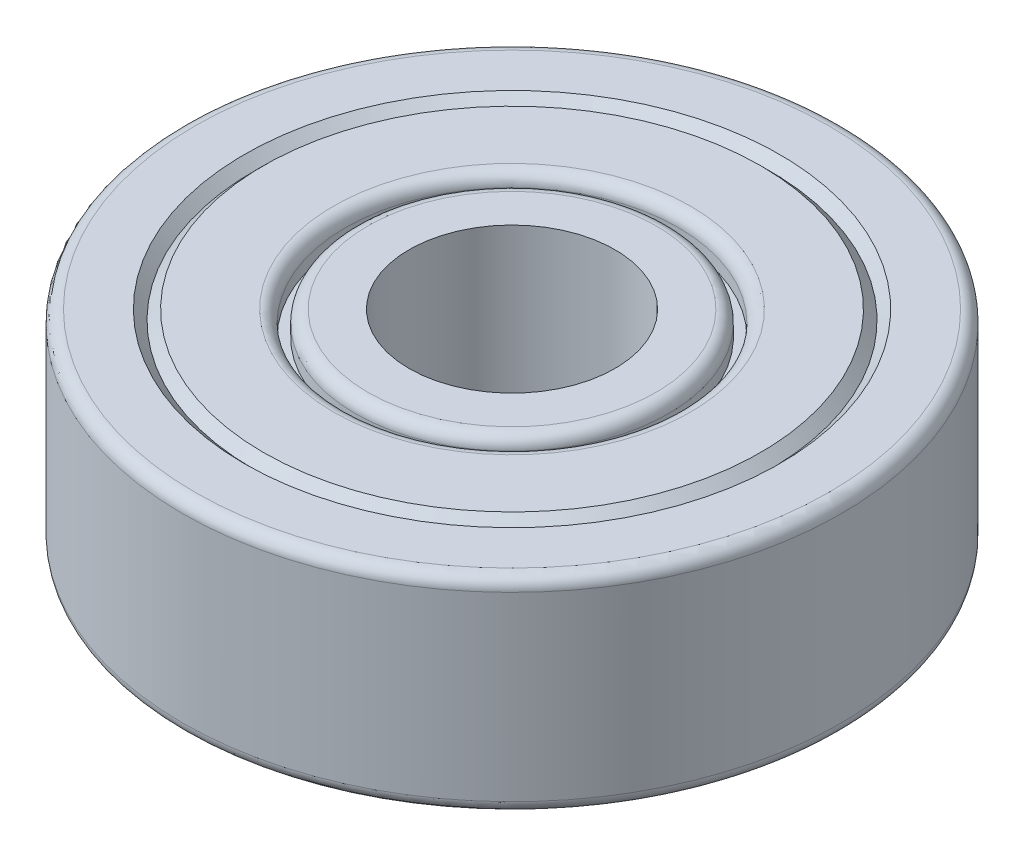
ISO-10303-21;
HEADER;
FILE_DESCRIPTION(('STEP AP214'),'2;1');
FILE_NAME('part.step','',(''),(''),'','','');
FILE_SCHEMA(('AUTOMOTIVE_DESIGN { 1 0 10303 214 1 1 1 1 }'));
ENDSEC;
DATA;
#1=APPLICATION_CONTEXT('core data for automotive mechanical design processes');
#2=APPLICATION_PROTOCOL_DEFINITION('international standard','automotive_design',2000,#1);
#3=PRODUCT_CONTEXT('',#1,'mechanical');
#4=PRODUCT('Part','Part','',(#3));
#5=PRODUCT_RELATED_PRODUCT_CATEGORY('part','',(#4));
#6=PRODUCT_DEFINITION_FORMATION('','',#4);
#7=PRODUCT_DEFINITION_CONTEXT('part definition',#1,'design');
#8=PRODUCT_DEFINITION('design','',#6,#7);
#9=PRODUCT_DEFINITION_SHAPE('','',#8);
#10=(LENGTH_UNIT() NAMED_UNIT(*) SI_UNIT(.MILLI.,.METRE.));
#11=(NAMED_UNIT(*) PLANE_ANGLE_UNIT() SI_UNIT($,.RADIAN.));
#12=(NAMED_UNIT(*) SI_UNIT($,.STERADIAN.) SOLID_ANGLE_UNIT());
#13=UNCERTAINTY_MEASURE_WITH_UNIT(LENGTH_MEASURE(1.E-05),#10,'distance_accuracy_value','');
#14=(GEOMETRIC_REPRESENTATION_CONTEXT(3) GLOBAL_UNCERTAINTY_ASSIGNED_CONTEXT((#13)) GLOBAL_UNIT_ASSIGNED_CONTEXT((#10,
#11,#12)) REPRESENTATION_CONTEXT('',''));
#15=CARTESIAN_POINT('',(0.,0.,0.));
#16=DIRECTION('',(0.,0.,1.));
#17=DIRECTION('',(1.,0.,0.));
#18=AXIS2_PLACEMENT_3D('',#15,#16,#17);
#19=CARTESIAN_POINT('',(-3.8,-3.68589743589745,0.));
#20=DIRECTION('',(0.,1.,0.));
#21=DIRECTION('',(0.,0.,1.));
#22=AXIS2_PLACEMENT_3D('',#19,#20,#21);
#23=PLANE('',#22);
#24=CARTESIAN_POINT('',(0.,-3.68589743589745,0.));
#25=DIRECTION('',(0.,1.,0.));
#26=DIRECTION('',(0.,0.,1.));
#27=AXIS2_PLACEMENT_3D('',#24,#25,#26);
#28=CIRCLE('',#27,3.5);
#29=CARTESIAN_POINT('',(0.,-3.68589743589745,3.5));
#30=VERTEX_POINT('',#29);
#31=EDGE_CURVE('E37',#30,#30,#28,.T.);
#32=ORIENTED_EDGE('',*,*,#31,.T.);
#33=EDGE_LOOP('',(#32));
#34=FACE_BOUND('',#33,.T.);
#35=CARTESIAN_POINT('',(0.,-3.68589743589745,0.));
#36=DIRECTION('',(0.,1.,0.));
#37=DIRECTION('',(0.,0.,1.));
#38=AXIS2_PLACEMENT_3D('',#35,#36,#37);
#39=CIRCLE('',#38,2.5);
#40=CARTESIAN_POINT('',(0.,-3.68589743589745,2.5));
#41=VERTEX_POINT('',#40);
#42=EDGE_CURVE('E74',#41,#41,#39,.T.);
#43=ORIENTED_EDGE('',*,*,#42,.F.);
#44=EDGE_LOOP('',(#43));
#45=FACE_BOUND('',#44,.T.);
#46=ADVANCED_FACE('F30',(#34,#45),#23,.T.);
#47=CARTESIAN_POINT('',(0.,0.,0.));
#48=DIRECTION('',(0.,1.,0.));
#49=DIRECTION('',(0.,0.,1.));
#50=AXIS2_PLACEMENT_3D('',#47,#48,#49);
#51=CYLINDRICAL_SURFACE('',#50,2.5);
#52=ORIENTED_EDGE('',*,*,#42,.T.);
#53=EDGE_LOOP('',(#52));
#54=FACE_BOUND('',#53,.T.);
#55=CARTESIAN_POINT('',(0.,-8.68589743589745,0.));
#56=DIRECTION('',(0.,1.,0.));
#57=DIRECTION('',(0.,0.,1.));
#58=AXIS2_PLACEMENT_3D('',#55,#56,#57);
#59=CIRCLE('',#58,2.5);
#60=CARTESIAN_POINT('',(0.,-8.68589743589745,2.5));
#61=VERTEX_POINT('',#60);
#62=EDGE_CURVE('E77',#61,#61,#59,.T.);
#63=ORIENTED_EDGE('',*,*,#62,.F.);
#64=EDGE_LOOP('',(#63));
#65=FACE_BOUND('',#64,.T.);
#66=ADVANCED_FACE('F128',(#54,#65),#51,.F.);
#67=CARTESIAN_POINT('',(-3.8,-8.68589743589745,0.));
#68=DIRECTION('',(0.,-1.,0.));
#69=DIRECTION('',(0.,0.,-1.));
#70=AXIS2_PLACEMENT_3D('',#67,#68,#69);
#71=PLANE('',#70);
#72=CARTESIAN_POINT('',(0.,-8.68589743589745,0.));
#73=DIRECTION('',(0.,-1.,0.));
#74=DIRECTION('',(0.,0.,-1.));
#75=AXIS2_PLACEMENT_3D('',#72,#73,#74);
#76=CIRCLE('',#75,3.5);
#77=CARTESIAN_POINT('',(0.,-8.68589743589745,-3.5));
#78=VERTEX_POINT('',#77);
#79=EDGE_CURVE('E68',#78,#78,#76,.T.);
#80=ORIENTED_EDGE('',*,*,#79,.T.);
#81=EDGE_LOOP('',(#80));
#82=FACE_BOUND('',#81,.T.);
#83=ORIENTED_EDGE('',*,*,#62,.T.);
#84=EDGE_LOOP('',(#83));
#85=FACE_BOUND('',#84,.T.);
#86=ADVANCED_FACE('F133',(#82,#85),#71,.T.);
#87=CARTESIAN_POINT('',(0.,0.,0.));
#88=DIRECTION('',(0.,1.,0.));
#89=DIRECTION('',(0.,0.,1.));
#90=AXIS2_PLACEMENT_3D('',#87,#88,#89);
#91=CYLINDRICAL_SURFACE('',#90,3.8);
#92=CARTESIAN_POINT('',(0.,-8.38589743589745,0.));
#93=DIRECTION('',(0.,-1.,0.));
#94=DIRECTION('',(0.,0.,-1.));
#95=AXIS2_PLACEMENT_3D('',#92,#93,#94);
#96=CIRCLE('',#95,3.8);
#97=CARTESIAN_POINT('',(0.,-8.38589743589745,-3.8));
#98=VERTEX_POINT('',#97);
#99=EDGE_CURVE('E71',#98,#98,#96,.F.);
#100=ORIENTED_EDGE('',*,*,#99,.T.);
#101=EDGE_LOOP('',(#100));
#102=FACE_BOUND('',#101,.T.);
#103=CARTESIAN_POINT('',(0.,-8.08589743589745,0.));
#104=DIRECTION('',(0.,1.,0.));
#105=DIRECTION('',(0.,0.,1.));
#106=AXIS2_PLACEMENT_3D('',#103,#104,#105);
#107=CIRCLE('',#106,3.8);
#108=CARTESIAN_POINT('',(0.,-8.08589743589745,3.8));
#109=VERTEX_POINT('',#108);
#110=EDGE_CURVE('E80',#109,#109,#107,.T.);
#111=ORIENTED_EDGE('',*,*,#110,.F.);
#112=EDGE_LOOP('',(#111));
#113=FACE_BOUND('',#112,.T.);
#114=ADVANCED_FACE('F213',(#102,#113),#91,.T.);
#115=CARTESIAN_POINT('',(-4.03283149176761,-8.08589743589745,0.));
#116=DIRECTION('',(0.,-1.,0.));
#117=DIRECTION('',(0.,0.,-1.));
#118=AXIS2_PLACEMENT_3D('',#115,#116,#117);
#119=PLANE('',#118);
#120=ORIENTED_EDGE('',*,*,#110,.T.);
#121=EDGE_LOOP('',(#120));
#122=FACE_BOUND('',#121,.T.);
#123=CARTESIAN_POINT('',(0.,-8.08589743589745,0.));
#124=DIRECTION('',(0.,1.,0.));
#125=DIRECTION('',(0.,0.,1.));
#126=AXIS2_PLACEMENT_3D('',#123,#124,#125);
#127=CIRCLE('',#126,4.03283149176761);
#128=CARTESIAN_POINT('',(0.,-8.08589743589745,4.03283149176761));
#129=VERTEX_POINT('',#128);
#130=EDGE_CURVE('E83',#129,#129,#127,.T.);
#131=ORIENTED_EDGE('',*,*,#130,.F.);
#132=EDGE_LOOP('',(#131));
#133=FACE_BOUND('',#132,.T.);
#134=ADVANCED_FACE('F209',(#122,#133),#119,.T.);
#135=CARTESIAN_POINT('',(0.,0.,0.));
#136=DIRECTION('',(0.,1.,0.));
#137=DIRECTION('',(0.,0.,1.));
#138=AXIS2_PLACEMENT_3D('',#135,#136,#137);
#139=CYLINDRICAL_SURFACE('',#138,4.03283149176761);
#140=CARTESIAN_POINT('',(0.,-8.38589743589745,0.));
#141=DIRECTION('',(0.,-1.,0.));
#142=DIRECTION('',(0.,0.,-1.));
#143=AXIS2_PLACEMENT_3D('',#140,#141,#142);
#144=CIRCLE('',#143,4.03283149176761);
#145=CARTESIAN_POINT('',(0.,-8.38589743589745,-4.03283149176761));
#146=VERTEX_POINT('',#145);
#147=EDGE_CURVE('E62',#146,#146,#144,.T.);
#148=ORIENTED_EDGE('',*,*,#147,.T.);
#149=EDGE_LOOP('',(#148));
#150=FACE_BOUND('',#149,.T.);
#151=ORIENTED_EDGE('',*,*,#130,.T.);
#152=EDGE_LOOP('',(#151));
#153=FACE_BOUND('',#152,.T.);
#154=ADVANCED_FACE('F205',(#150,#153),#139,.F.);
#155=CARTESIAN_POINT('',(-6.03283149176761,-8.68589743589746,0.));
#156=DIRECTION('',(0.,-1.,0.));
#157=DIRECTION('',(0.,0.,-1.));
#158=AXIS2_PLACEMENT_3D('',#155,#156,#157);
#159=PLANE('',#158);
#160=CARTESIAN_POINT('',(0.,-8.68589743589746,0.));
#161=DIRECTION('',(0.,-1.,0.));
#162=DIRECTION('',(0.,0.,-1.));
#163=AXIS2_PLACEMENT_3D('',#160,#161,#162);
#164=CIRCLE('',#163,4.33283149176761);
#165=CARTESIAN_POINT('',(0.,-8.68589743589746,-4.33283149176761));
#166=VERTEX_POINT('',#165);
#167=EDGE_CURVE('E65',#166,#166,#164,.F.);
#168=ORIENTED_EDGE('',*,*,#167,.T.);
#169=EDGE_LOOP('',(#168));
#170=FACE_BOUND('',#169,.T.);
#171=CARTESIAN_POINT('',(0.,-8.68589743589746,0.));
#172=DIRECTION('',(0.,1.,0.));
#173=DIRECTION('',(0.,0.,1.));
#174=AXIS2_PLACEMENT_3D('',#171,#172,#173);
#175=CIRCLE('',#174,6.03283149176761);
#176=CARTESIAN_POINT('',(0.,-8.68589743589746,6.03283149176761));
#177=VERTEX_POINT('',#176);
#178=EDGE_CURVE('E86',#177,#177,#175,.T.);
#179=ORIENTED_EDGE('',*,*,#178,.F.);
#180=EDGE_LOOP('',(#179));
#181=FACE_BOUND('',#180,.T.);
#182=ADVANCED_FACE('F201',(#170,#181),#159,.T.);
#183=CARTESIAN_POINT('',(0.,-8.45231318178126,0.));
#184=DIRECTION('',(0.,1.,0.));
#185=DIRECTION('',(0.,0.,1.));
#186=AXIS2_PLACEMENT_3D('',#183,#184,#185);
#187=CONICAL_SURFACE('',#186,6.26641574588381,0.785398163397448);
#188=ORIENTED_EDGE('',*,*,#178,.T.);
#189=EDGE_LOOP('',(#188));
#190=FACE_BOUND('',#189,.T.);
#191=CARTESIAN_POINT('',(0.,-8.45231318178126,0.));
#192=DIRECTION('',(0.,1.,0.));
#193=DIRECTION('',(0.,0.,1.));
#194=AXIS2_PLACEMENT_3D('',#191,#192,#193);
#195=CIRCLE('',#194,6.26641574588381);
#196=CARTESIAN_POINT('',(0.,-8.45231318178126,6.26641574588381));
#197=VERTEX_POINT('',#196);
#198=EDGE_CURVE('E89',#197,#197,#195,.T.);
#199=ORIENTED_EDGE('',*,*,#198,.F.);
#200=EDGE_LOOP('',(#199));
#201=FACE_BOUND('',#200,.T.);
#202=ADVANCED_FACE('F197',(#190,#201),#187,.T.);
#203=CARTESIAN_POINT('',(0.,-8.68589743589746,0.));
#204=DIRECTION('',(0.,-1.,0.));
#205=DIRECTION('',(0.,0.,-1.));
#206=AXIS2_PLACEMENT_3D('',#203,#204,#205);
#207=CONICAL_SURFACE('',#206,6.5,0.785398163397448);
#208=ORIENTED_EDGE('',*,*,#198,.T.);
#209=EDGE_LOOP('',(#208));
#210=FACE_BOUND('',#209,.T.);
#211=CARTESIAN_POINT('',(0.,-8.68589743589746,0.));
#212=DIRECTION('',(0.,1.,0.));
#213=DIRECTION('',(0.,0.,1.));
#214=AXIS2_PLACEMENT_3D('',#211,#212,#213);
#215=CIRCLE('',#214,6.5);
#216=CARTESIAN_POINT('',(0.,-8.68589743589746,6.5));
#217=VERTEX_POINT('',#216);
#218=EDGE_CURVE('E92',#217,#217,#215,.T.);
#219=ORIENTED_EDGE('',*,*,#218,.F.);
#220=EDGE_LOOP('',(#219));
#221=FACE_BOUND('',#220,.T.);
#222=ADVANCED_FACE('F193',(#210,#221),#207,.F.);
#223=CARTESIAN_POINT('',(-8.,-8.68589743589746,0.));
#224=DIRECTION('',(0.,-1.,0.));
#225=DIRECTION('',(0.,0.,-1.));
#226=AXIS2_PLACEMENT_3D('',#223,#224,#225);
#227=PLANE('',#226);
#228=CARTESIAN_POINT('',(0.,-8.68589743589746,0.));
#229=DIRECTION('',(0.,-1.,0.));
#230=DIRECTION('',(0.,0.,-1.));
#231=AXIS2_PLACEMENT_3D('',#228,#229,#230);
#232=CIRCLE('',#231,7.7);
#233=CARTESIAN_POINT('',(0.,-8.68589743589746,-7.7));
#234=VERTEX_POINT('',#233);
#235=EDGE_CURVE('E53',#234,#234,#232,.T.);
#236=ORIENTED_EDGE('',*,*,#235,.T.);
#237=EDGE_LOOP('',(#236));
#238=FACE_BOUND('',#237,.T.);
#239=ORIENTED_EDGE('',*,*,#218,.T.);
#240=EDGE_LOOP('',(#239));
#241=FACE_BOUND('',#240,.T.);
#242=ADVANCED_FACE('F189',(#238,#241),#227,.T.);
#243=CARTESIAN_POINT('',(0.,0.,0.));
#244=DIRECTION('',(0.,1.,0.));
#245=DIRECTION('',(0.,0.,1.));
#246=AXIS2_PLACEMENT_3D('',#243,#244,#245);
#247=CYLINDRICAL_SURFACE('',#246,8.);
#248=CARTESIAN_POINT('',(0.,-8.38589743589745,0.));
#249=DIRECTION('',(0.,-1.,0.));
#250=DIRECTION('',(0.,0.,-1.));
#251=AXIS2_PLACEMENT_3D('',#248,#249,#250);
#252=CIRCLE('',#251,8.);
#253=CARTESIAN_POINT('',(0.,-8.38589743589745,-8.));
#254=VERTEX_POINT('',#253);
#255=EDGE_CURVE('E56',#254,#254,#252,.F.);
#256=ORIENTED_EDGE('',*,*,#255,.T.);
#257=EDGE_LOOP('',(#256));
#258=FACE_BOUND('',#257,.T.);
#259=CARTESIAN_POINT('',(0.,-3.98589743589745,0.));
#260=DIRECTION('',(0.,1.,0.));
#261=DIRECTION('',(0.,0.,1.));
#262=AXIS2_PLACEMENT_3D('',#259,#260,#261);
#263=CIRCLE('',#262,8.);
#264=CARTESIAN_POINT('',(0.,-3.98589743589745,8.));
#265=VERTEX_POINT('',#264);
#266=EDGE_CURVE('E59',#265,#265,#263,.F.);
#267=ORIENTED_EDGE('',*,*,#266,.T.);
#268=EDGE_LOOP('',(#267));
#269=FACE_BOUND('',#268,.T.);
#270=ADVANCED_FACE('F185',(#258,#269),#247,.T.);
#271=CARTESIAN_POINT('',(-8.,-3.68589743589745,0.));
#272=DIRECTION('',(0.,1.,0.));
#273=DIRECTION('',(0.,0.,1.));
#274=AXIS2_PLACEMENT_3D('',#271,#272,#273);
#275=PLANE('',#274);
#276=CARTESIAN_POINT('',(0.,-3.68589743589745,0.));
#277=DIRECTION('',(0.,1.,0.));
#278=DIRECTION('',(0.,0.,1.));
#279=AXIS2_PLACEMENT_3D('',#276,#277,#278);
#280=CIRCLE('',#279,7.7);
#281=CARTESIAN_POINT('',(0.,-3.68589743589745,7.7));
#282=VERTEX_POINT('',#281);
#283=EDGE_CURVE('E50',#282,#282,#280,.T.);
#284=ORIENTED_EDGE('',*,*,#283,.T.);
#285=EDGE_LOOP('',(#284));
#286=FACE_BOUND('',#285,.T.);
#287=CARTESIAN_POINT('',(0.,-3.68589743589745,0.));
#288=DIRECTION('',(0.,1.,0.));
#289=DIRECTION('',(0.,0.,1.));
#290=AXIS2_PLACEMENT_3D('',#287,#288,#289);
#291=CIRCLE('',#290,6.5);
#292=CARTESIAN_POINT('',(0.,-3.68589743589745,6.5));
#293=VERTEX_POINT('',#292);
#294=EDGE_CURVE('E95',#293,#293,#291,.T.);
#295=ORIENTED_EDGE('',*,*,#294,.F.);
#296=EDGE_LOOP('',(#295));
#297=FACE_BOUND('',#296,.T.);
#298=ADVANCED_FACE('F179',(#286,#297),#275,.T.);
#299=CARTESIAN_POINT('',(0.,-3.91948169001365,0.));
#300=DIRECTION('',(0.,1.,0.));
#301=DIRECTION('',(0.,0.,1.));
#302=AXIS2_PLACEMENT_3D('',#299,#300,#301);
#303=CONICAL_SURFACE('',#302,6.26641574588381,0.785398163397448);
#304=ORIENTED_EDGE('',*,*,#294,.T.);
#305=EDGE_LOOP('',(#304));
#306=FACE_BOUND('',#305,.T.);
#307=CARTESIAN_POINT('',(0.,-3.91948169001365,0.));
#308=DIRECTION('',(0.,1.,0.));
#309=DIRECTION('',(0.,0.,1.));
#310=AXIS2_PLACEMENT_3D('',#307,#308,#309);
#311=CIRCLE('',#310,6.26641574588381);
#312=CARTESIAN_POINT('',(0.,-3.91948169001365,6.26641574588381));
#313=VERTEX_POINT('',#312);
#314=EDGE_CURVE('E98',#313,#313,#311,.T.);
#315=ORIENTED_EDGE('',*,*,#314,.F.);
#316=EDGE_LOOP('',(#315));
#317=FACE_BOUND('',#316,.T.);
#318=ADVANCED_FACE('F173',(#306,#317),#303,.F.);
#319=CARTESIAN_POINT('',(0.,-3.68589743589745,0.));
#320=DIRECTION('',(0.,-1.,0.));
#321=DIRECTION('',(0.,0.,-1.));
#322=AXIS2_PLACEMENT_3D('',#319,#320,#321);
#323=CONICAL_SURFACE('',#322,6.03283149176761,0.785398163397452);
#324=ORIENTED_EDGE('',*,*,#314,.T.);
#325=EDGE_LOOP('',(#324));
#326=FACE_BOUND('',#325,.T.);
#327=CARTESIAN_POINT('',(0.,-3.68589743589745,0.));
#328=DIRECTION('',(0.,1.,0.));
#329=DIRECTION('',(0.,0.,1.));
#330=AXIS2_PLACEMENT_3D('',#327,#328,#329);
#331=CIRCLE('',#330,6.03283149176761);
#332=CARTESIAN_POINT('',(0.,-3.68589743589745,6.03283149176761));
#333=VERTEX_POINT('',#332);
#334=EDGE_CURVE('E101',#333,#333,#331,.T.);
#335=ORIENTED_EDGE('',*,*,#334,.F.);
#336=EDGE_LOOP('',(#335));
#337=FACE_BOUND('',#336,.T.);
#338=ADVANCED_FACE('F168',(#326,#337),#323,.T.);
#339=CARTESIAN_POINT('',(-6.03283149176761,-3.68589743589745,0.));
#340=DIRECTION('',(0.,1.,0.));
#341=DIRECTION('',(0.,0.,1.));
#342=AXIS2_PLACEMENT_3D('',#339,#340,#341);
#343=PLANE('',#342);
#344=CARTESIAN_POINT('',(0.,-3.68589743589745,0.));
#345=DIRECTION('',(0.,1.,0.));
#346=DIRECTION('',(0.,0.,1.));
#347=AXIS2_PLACEMENT_3D('',#344,#345,#346);
#348=CIRCLE('',#347,4.33283149176761);
#349=CARTESIAN_POINT('',(0.,-3.68589743589745,4.33283149176761));
#350=VERTEX_POINT('',#349);
#351=EDGE_CURVE('E41',#350,#350,#348,.F.);
#352=ORIENTED_EDGE('',*,*,#351,.T.);
#353=EDGE_LOOP('',(#352));
#354=FACE_BOUND('',#353,.T.);
#355=ORIENTED_EDGE('',*,*,#334,.T.);
#356=EDGE_LOOP('',(#355));
#357=FACE_BOUND('',#356,.T.);
#358=ADVANCED_FACE('F124',(#354,#357),#343,.T.);
#359=CARTESIAN_POINT('',(0.,0.,0.));
#360=DIRECTION('',(0.,1.,0.));
#361=DIRECTION('',(0.,0.,1.));
#362=AXIS2_PLACEMENT_3D('',#359,#360,#361);
#363=CYLINDRICAL_SURFACE('',#362,4.03283149176761);
#364=CARTESIAN_POINT('',(0.,-3.98589743589745,0.));
#365=DIRECTION('',(0.,1.,0.));
#366=DIRECTION('',(0.,0.,1.));
#367=AXIS2_PLACEMENT_3D('',#364,#365,#366);
#368=CIRCLE('',#367,4.03283149176761);
#369=CARTESIAN_POINT('',(0.,-3.98589743589745,4.03283149176761));
#370=VERTEX_POINT('',#369);
#371=EDGE_CURVE('E45',#370,#370,#368,.T.);
#372=ORIENTED_EDGE('',*,*,#371,.T.);
#373=EDGE_LOOP('',(#372));
#374=FACE_BOUND('',#373,.T.);
#375=CARTESIAN_POINT('',(0.,-4.28589743589745,0.));
#376=DIRECTION('',(0.,1.,0.));
#377=DIRECTION('',(0.,0.,1.));
#378=AXIS2_PLACEMENT_3D('',#375,#376,#377);
#379=CIRCLE('',#378,4.03283149176761);
#380=CARTESIAN_POINT('',(0.,-4.28589743589745,4.03283149176761));
#381=VERTEX_POINT('',#380);
#382=EDGE_CURVE('E104',#381,#381,#379,.T.);
#383=ORIENTED_EDGE('',*,*,#382,.F.);
#384=EDGE_LOOP('',(#383));
#385=FACE_BOUND('',#384,.T.);
#386=ADVANCED_FACE('F115',(#374,#385),#363,.F.);
#387=CARTESIAN_POINT('',(-4.03283149176761,-4.28589743589745,0.));
#388=DIRECTION('',(0.,1.,0.));
#389=DIRECTION('',(0.,0.,1.));
#390=AXIS2_PLACEMENT_3D('',#387,#388,#389);
#391=PLANE('',#390);
#392=ORIENTED_EDGE('',*,*,#382,.T.);
#393=EDGE_LOOP('',(#392));
#394=FACE_BOUND('',#393,.T.);
#395=CARTESIAN_POINT('',(0.,-4.28589743589745,0.));
#396=DIRECTION('',(0.,1.,0.));
#397=DIRECTION('',(0.,0.,1.));
#398=AXIS2_PLACEMENT_3D('',#395,#396,#397);
#399=CIRCLE('',#398,3.8);
#400=CARTESIAN_POINT('',(0.,-4.28589743589745,3.8));
#401=VERTEX_POINT('',#400);
#402=EDGE_CURVE('E107',#401,#401,#399,.T.);
#403=ORIENTED_EDGE('',*,*,#402,.F.);
#404=EDGE_LOOP('',(#403));
#405=FACE_BOUND('',#404,.T.);
#406=ADVANCED_FACE('F113',(#394,#405),#391,.T.);
#407=CARTESIAN_POINT('',(0.,0.,0.));
#408=DIRECTION('',(0.,1.,0.));
#409=DIRECTION('',(0.,0.,1.));
#410=AXIS2_PLACEMENT_3D('',#407,#408,#409);
#411=CYLINDRICAL_SURFACE('',#410,3.8);
#412=CARTESIAN_POINT('',(0.,-3.98589743589745,0.));
#413=DIRECTION('',(0.,1.,0.));
#414=DIRECTION('',(0.,0.,1.));
#415=AXIS2_PLACEMENT_3D('',#412,#413,#414);
#416=CIRCLE('',#415,3.8);
#417=CARTESIAN_POINT('',(0.,-3.98589743589745,3.8));
#418=VERTEX_POINT('',#417);
#419=EDGE_CURVE('E10',#418,#418,#416,.F.);
#420=ORIENTED_EDGE('',*,*,#419,.T.);
#421=EDGE_LOOP('',(#420));
#422=FACE_BOUND('',#421,.T.);
#423=ORIENTED_EDGE('',*,*,#402,.T.);
#424=EDGE_LOOP('',(#423));
#425=FACE_BOUND('',#424,.T.);
#426=ADVANCED_FACE('F111',(#422,#425),#411,.T.);
#427=CARTESIAN_POINT('',(0.,-8.38589743589745,0.));
#428=DIRECTION('',(0.,-1.,0.));
#429=DIRECTION('',(0.,0.,-1.));
#430=AXIS2_PLACEMENT_3D('',#427,#428,#429);
#431=TOROIDAL_SURFACE('',#430,3.5,0.3);
#432=ORIENTED_EDGE('',*,*,#79,.F.);
#433=EDGE_LOOP('',(#432));
#434=FACE_BOUND('',#433,.T.);
#435=ORIENTED_EDGE('',*,*,#99,.F.);
#436=EDGE_LOOP('',(#435));
#437=FACE_BOUND('',#436,.T.);
#438=ADVANCED_FACE('F122',(#434,#437),#431,.T.);
#439=CARTESIAN_POINT('',(0.,-8.38589743589745,0.));
#440=DIRECTION('',(0.,-1.,0.));
#441=DIRECTION('',(0.,0.,-1.));
#442=AXIS2_PLACEMENT_3D('',#439,#440,#441);
#443=TOROIDAL_SURFACE('',#442,4.33283149176761,0.3);
#444=ORIENTED_EDGE('',*,*,#147,.F.);
#445=EDGE_LOOP('',(#444));
#446=FACE_BOUND('',#445,.T.);
#447=ORIENTED_EDGE('',*,*,#167,.F.);
#448=EDGE_LOOP('',(#447));
#449=FACE_BOUND('',#448,.T.);
#450=ADVANCED_FACE('F141',(#446,#449),#443,.T.);
#451=CARTESIAN_POINT('',(0.,-8.38589743589745,0.));
#452=DIRECTION('',(0.,-1.,0.));
#453=DIRECTION('',(0.,0.,-1.));
#454=AXIS2_PLACEMENT_3D('',#451,#452,#453);
#455=TOROIDAL_SURFACE('',#454,7.7,0.3);
#456=ORIENTED_EDGE('',*,*,#235,.F.);
#457=EDGE_LOOP('',(#456));
#458=FACE_BOUND('',#457,.T.);
#459=ORIENTED_EDGE('',*,*,#255,.F.);
#460=EDGE_LOOP('',(#459));
#461=FACE_BOUND('',#460,.T.);
#462=ADVANCED_FACE('F145',(#458,#461),#455,.T.);
#463=CARTESIAN_POINT('',(0.,-3.98589743589745,0.));
#464=DIRECTION('',(0.,1.,0.));
#465=DIRECTION('',(0.,0.,1.));
#466=AXIS2_PLACEMENT_3D('',#463,#464,#465);
#467=TOROIDAL_SURFACE('',#466,7.7,0.3);
#468=ORIENTED_EDGE('',*,*,#266,.F.);
#469=EDGE_LOOP('',(#468));
#470=FACE_BOUND('',#469,.T.);
#471=ORIENTED_EDGE('',*,*,#283,.F.);
#472=EDGE_LOOP('',(#471));
#473=FACE_BOUND('',#472,.T.);
#474=ADVANCED_FACE('F149',(#470,#473),#467,.T.);
#475=CARTESIAN_POINT('',(0.,-3.98589743589745,0.));
#476=DIRECTION('',(0.,1.,0.));
#477=DIRECTION('',(0.,0.,1.));
#478=AXIS2_PLACEMENT_3D('',#475,#476,#477);
#479=TOROIDAL_SURFACE('',#478,4.33283149176761,0.3);
#480=ORIENTED_EDGE('',*,*,#351,.F.);
#481=EDGE_LOOP('',(#480));
#482=FACE_BOUND('',#481,.T.);
#483=ORIENTED_EDGE('',*,*,#371,.F.);
#484=EDGE_LOOP('',(#483));
#485=FACE_BOUND('',#484,.T.);
#486=ADVANCED_FACE('F152',(#482,#485),#479,.T.);
#487=CARTESIAN_POINT('',(0.,-3.98589743589745,0.));
#488=DIRECTION('',(0.,1.,0.));
#489=DIRECTION('',(0.,0.,1.));
#490=AXIS2_PLACEMENT_3D('',#487,#488,#489);
#491=TOROIDAL_SURFACE('',#490,3.5,0.3);
#492=ORIENTED_EDGE('',*,*,#419,.F.);
#493=EDGE_LOOP('',(#492));
#494=FACE_BOUND('',#493,.T.);
#495=ORIENTED_EDGE('',*,*,#31,.F.);
#496=EDGE_LOOP('',(#495));
#497=FACE_BOUND('',#496,.T.);
#498=ADVANCED_FACE('F32',(#494,#497),#491,.T.);
#499=CLOSED_SHELL('',(#46,#66,#86,#114,#134,#154,#182,#202,#222,#242,#270,#298,#318,#338,#358,
#386,#406,#426,#438,#450,#462,#474,#486,#498));
#500=MANIFOLD_SOLID_BREP('B2',#499);
#501=ADVANCED_BREP_SHAPE_REPRESENTATION('',(#18,#500),#14);
#502=SHAPE_DEFINITION_REPRESENTATION(#9,#501);
ENDSEC;
END-ISO-10303-21;
